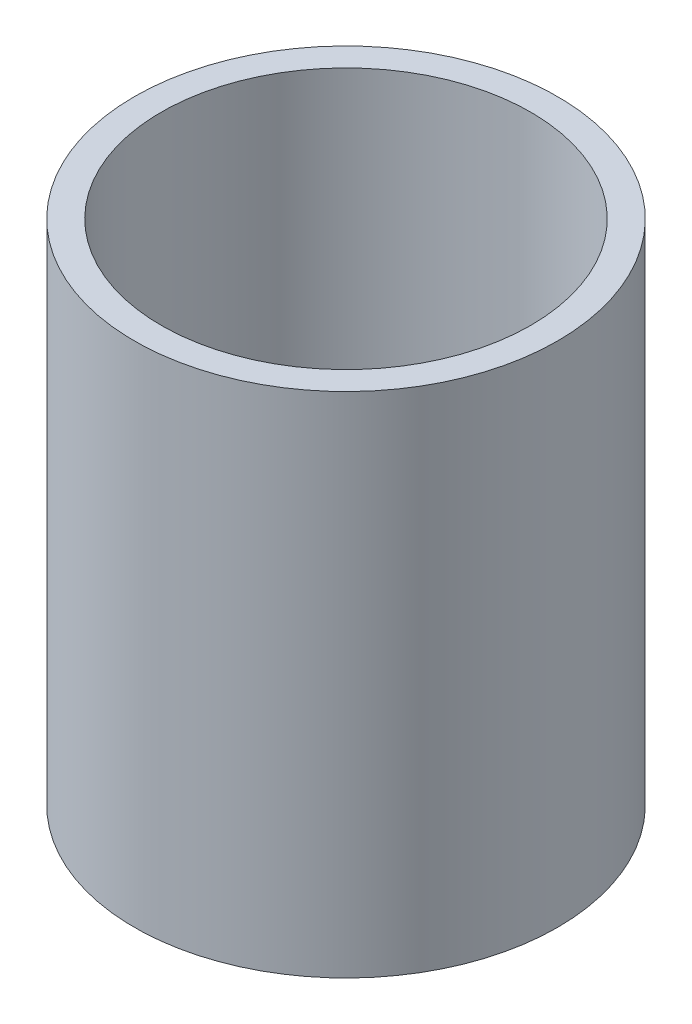
ISO-10303-21;
HEADER;
FILE_DESCRIPTION(('STEP AP214'),'2;1');
FILE_NAME('part.step','',(''),(''),'','','');
FILE_SCHEMA(('AUTOMOTIVE_DESIGN { 1 0 10303 214 1 1 1 1 }'));
ENDSEC;
DATA;
#1=APPLICATION_CONTEXT('core data for automotive mechanical design processes');
#2=APPLICATION_PROTOCOL_DEFINITION('international standard','automotive_design',2000,#1);
#3=PRODUCT_CONTEXT('',#1,'mechanical');
#4=PRODUCT('Part','Part','',(#3));
#5=PRODUCT_RELATED_PRODUCT_CATEGORY('part','',(#4));
#6=PRODUCT_DEFINITION_FORMATION('','',#4);
#7=PRODUCT_DEFINITION_CONTEXT('part definition',#1,'design');
#8=PRODUCT_DEFINITION('design','',#6,#7);
#9=PRODUCT_DEFINITION_SHAPE('','',#8);
#10=(LENGTH_UNIT() NAMED_UNIT(*) SI_UNIT(.MILLI.,.METRE.));
#11=(NAMED_UNIT(*) PLANE_ANGLE_UNIT() SI_UNIT($,.RADIAN.));
#12=(NAMED_UNIT(*) SI_UNIT($,.STERADIAN.) SOLID_ANGLE_UNIT());
#13=UNCERTAINTY_MEASURE_WITH_UNIT(LENGTH_MEASURE(1.E-05),#10,'distance_accuracy_value','');
#14=(GEOMETRIC_REPRESENTATION_CONTEXT(3) GLOBAL_UNCERTAINTY_ASSIGNED_CONTEXT((#13)) GLOBAL_UNIT_ASSIGNED_CONTEXT((#10,
#11,#12)) REPRESENTATION_CONTEXT('',''));
#15=CARTESIAN_POINT('',(0.,0.,0.));
#16=DIRECTION('',(0.,0.,1.));
#17=DIRECTION('',(1.,0.,0.));
#18=AXIS2_PLACEMENT_3D('',#15,#16,#17);
#19=CARTESIAN_POINT('',(0.,0.,0.));
#20=DIRECTION('',(0.,-1.,0.));
#21=DIRECTION('',(1.,0.,0.));
#22=AXIS2_PLACEMENT_3D('',#19,#20,#21);
#23=PLANE('',#22);
#24=CARTESIAN_POINT('',(0.,0.,0.));
#25=DIRECTION('',(0.,-1.,0.));
#26=DIRECTION('',(1.,0.,0.));
#27=AXIS2_PLACEMENT_3D('',#24,#25,#26);
#28=CIRCLE('',#27,12.5);
#29=CARTESIAN_POINT('',(12.5,0.,0.));
#30=VERTEX_POINT('',#29);
#31=EDGE_CURVE('E10',#30,#30,#28,.T.);
#32=ORIENTED_EDGE('',*,*,#31,.T.);
#33=EDGE_LOOP('',(#32));
#34=FACE_BOUND('',#33,.T.);
#35=ADVANCED_FACE('F37',(#34),#23,.T.);
#36=CARTESIAN_POINT('',(0.,0.,0.));
#37=DIRECTION('',(0.,-1.,0.));
#38=DIRECTION('',(1.,0.,0.));
#39=AXIS2_PLACEMENT_3D('',#36,#37,#38);
#40=CYLINDRICAL_SURFACE('',#39,12.5);
#41=CARTESIAN_POINT('',(0.,30.,0.));
#42=DIRECTION('',(0.,-1.,0.));
#43=DIRECTION('',(1.,0.,0.));
#44=AXIS2_PLACEMENT_3D('',#41,#42,#43);
#45=CIRCLE('',#44,12.5);
#46=CARTESIAN_POINT('',(12.5,30.,0.));
#47=VERTEX_POINT('',#46);
#48=EDGE_CURVE('E44',#47,#47,#45,.T.);
#49=ORIENTED_EDGE('',*,*,#48,.T.);
#50=EDGE_LOOP('',(#49));
#51=FACE_BOUND('',#50,.T.);
#52=ORIENTED_EDGE('',*,*,#31,.F.);
#53=EDGE_LOOP('',(#52));
#54=FACE_BOUND('',#53,.T.);
#55=ADVANCED_FACE('F73',(#51,#54),#40,.T.);
#56=CARTESIAN_POINT('',(12.5,30.,0.));
#57=DIRECTION('',(0.,1.,0.));
#58=DIRECTION('',(-1.,0.,0.));
#59=AXIS2_PLACEMENT_3D('',#56,#57,#58);
#60=PLANE('',#59);
#61=CARTESIAN_POINT('',(0.,30.,0.));
#62=DIRECTION('',(0.,-1.,0.));
#63=DIRECTION('',(1.,0.,0.));
#64=AXIS2_PLACEMENT_3D('',#61,#62,#63);
#65=CIRCLE('',#64,10.9125);
#66=CARTESIAN_POINT('',(10.9125,30.,0.));
#67=VERTEX_POINT('',#66);
#68=EDGE_CURVE('E49',#67,#67,#65,.T.);
#69=ORIENTED_EDGE('',*,*,#68,.T.);
#70=EDGE_LOOP('',(#69));
#71=FACE_BOUND('',#70,.T.);
#72=ORIENTED_EDGE('',*,*,#48,.F.);
#73=EDGE_LOOP('',(#72));
#74=FACE_BOUND('',#73,.T.);
#75=ADVANCED_FACE('F70',(#71,#74),#60,.T.);
#76=CARTESIAN_POINT('',(0.,0.,0.));
#77=DIRECTION('',(0.,-1.,0.));
#78=DIRECTION('',(1.,0.,0.));
#79=AXIS2_PLACEMENT_3D('',#76,#77,#78);
#80=CYLINDRICAL_SURFACE('',#79,10.9125);
#81=CARTESIAN_POINT('',(0.,1.5875,0.));
#82=DIRECTION('',(0.,-1.,0.));
#83=DIRECTION('',(1.,0.,0.));
#84=AXIS2_PLACEMENT_3D('',#81,#82,#83);
#85=CIRCLE('',#84,10.9125);
#86=CARTESIAN_POINT('',(10.9125,1.5875,0.));
#87=VERTEX_POINT('',#86);
#88=EDGE_CURVE('E54',#87,#87,#85,.T.);
#89=ORIENTED_EDGE('',*,*,#88,.T.);
#90=EDGE_LOOP('',(#89));
#91=FACE_BOUND('',#90,.T.);
#92=ORIENTED_EDGE('',*,*,#68,.F.);
#93=EDGE_LOOP('',(#92));
#94=FACE_BOUND('',#93,.T.);
#95=ADVANCED_FACE('F61',(#91,#94),#80,.F.);
#96=CARTESIAN_POINT('',(10.9125,1.5875,0.));
#97=DIRECTION('',(0.,1.,0.));
#98=DIRECTION('',(-1.,0.,0.));
#99=AXIS2_PLACEMENT_3D('',#96,#97,#98);
#100=PLANE('',#99);
#101=ORIENTED_EDGE('',*,*,#88,.F.);
#102=EDGE_LOOP('',(#101));
#103=FACE_BOUND('',#102,.T.);
#104=ADVANCED_FACE('F64',(#103),#100,.T.);
#105=CLOSED_SHELL('',(#35,#55,#75,#95,#104));
#106=MANIFOLD_SOLID_BREP('B2',#105);
#107=ADVANCED_BREP_SHAPE_REPRESENTATION('',(#18,#106),#14);
#108=SHAPE_DEFINITION_REPRESENTATION(#9,#107);
ENDSEC;
END-ISO-10303-21;
